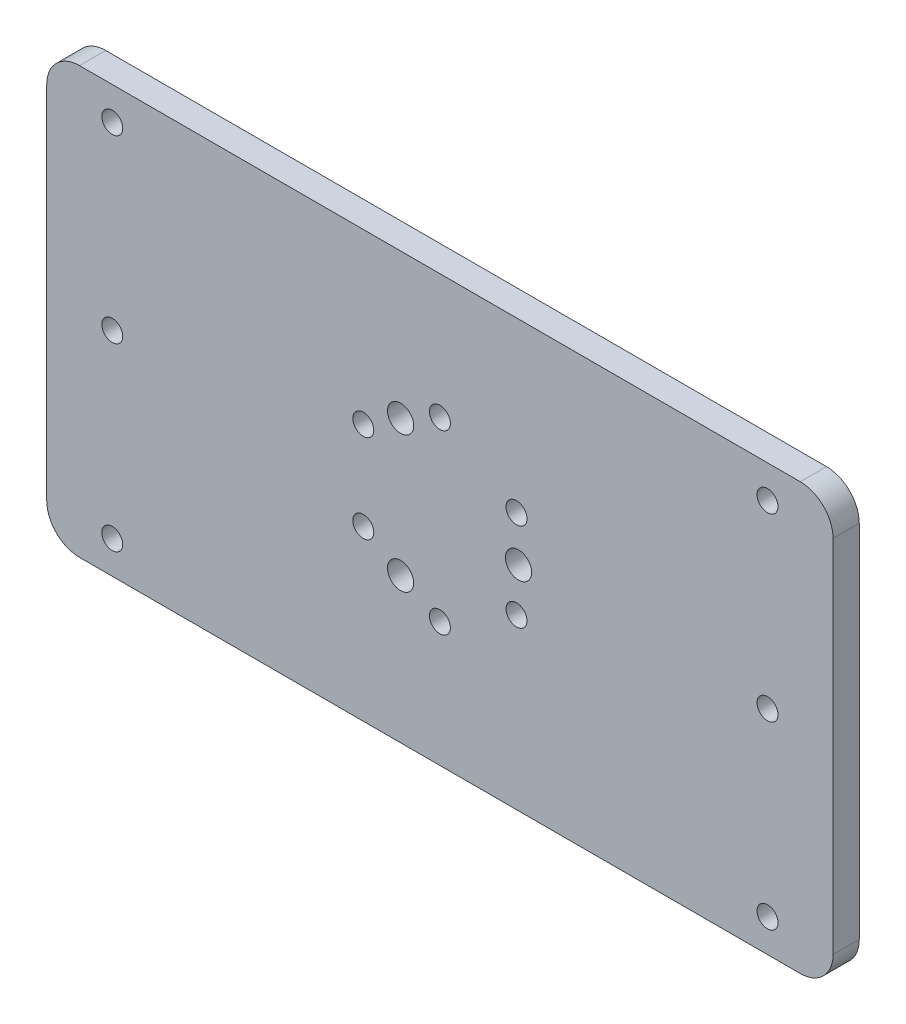
ISO-10303-21;
HEADER;
FILE_DESCRIPTION(('STEP AP214'),'2;1');
FILE_NAME('part.step','',(''),(''),'','','');
FILE_SCHEMA(('AUTOMOTIVE_DESIGN { 1 0 10303 214 1 1 1 1 }'));
ENDSEC;
DATA;
#1=APPLICATION_CONTEXT('core data for automotive mechanical design processes');
#2=APPLICATION_PROTOCOL_DEFINITION('international standard','automotive_design',2000,#1);
#3=PRODUCT_CONTEXT('',#1,'mechanical');
#4=PRODUCT('Part','Part','',(#3));
#5=PRODUCT_RELATED_PRODUCT_CATEGORY('part','',(#4));
#6=PRODUCT_DEFINITION_FORMATION('','',#4);
#7=PRODUCT_DEFINITION_CONTEXT('part definition',#1,'design');
#8=PRODUCT_DEFINITION('design','',#6,#7);
#9=PRODUCT_DEFINITION_SHAPE('','',#8);
#10=(LENGTH_UNIT() NAMED_UNIT(*) SI_UNIT(.MILLI.,.METRE.));
#11=(NAMED_UNIT(*) PLANE_ANGLE_UNIT() SI_UNIT($,.RADIAN.));
#12=(NAMED_UNIT(*) SI_UNIT($,.STERADIAN.) SOLID_ANGLE_UNIT());
#13=UNCERTAINTY_MEASURE_WITH_UNIT(LENGTH_MEASURE(1.E-05),#10,'distance_accuracy_value','');
#14=(GEOMETRIC_REPRESENTATION_CONTEXT(3) GLOBAL_UNCERTAINTY_ASSIGNED_CONTEXT((#13)) GLOBAL_UNIT_ASSIGNED_CONTEXT((#10,
#11,#12)) REPRESENTATION_CONTEXT('',''));
#15=CARTESIAN_POINT('',(0.,0.,0.));
#16=DIRECTION('',(0.,0.,1.));
#17=DIRECTION('',(1.,0.,0.));
#18=AXIS2_PLACEMENT_3D('',#15,#16,#17);
#19=CARTESIAN_POINT('',(0.,0.,4.));
#20=DIRECTION('',(1.,0.,0.));
#21=DIRECTION('',(0.,0.,-1.));
#22=AXIS2_PLACEMENT_3D('',#19,#20,#21);
#23=PLANE('',#22);
#24=DIRECTION('',(0.,-1.,0.));
#25=VECTOR('',#24,1.);
#26=CARTESIAN_POINT('',(0.,0.,0.));
#27=LINE('',#26,#25);
#28=CARTESIAN_POINT('',(0.,-5.,0.));
#29=VERTEX_POINT('',#28);
#30=CARTESIAN_POINT('',(0.,-60.,0.));
#31=VERTEX_POINT('',#30);
#32=EDGE_CURVE('E207',#29,#31,#27,.T.);
#33=ORIENTED_EDGE('',*,*,#32,.T.);
#34=DIRECTION('',(0.,0.,-1.));
#35=VECTOR('',#34,1.);
#36=CARTESIAN_POINT('',(0.,-60.,4.));
#37=LINE('',#36,#35);
#38=CARTESIAN_POINT('',(0.,-60.,4.));
#39=VERTEX_POINT('',#38);
#40=EDGE_CURVE('E11',#31,#39,#37,.F.);
#41=ORIENTED_EDGE('',*,*,#40,.T.);
#42=DIRECTION('',(0.,-1.,0.));
#43=VECTOR('',#42,1.);
#44=CARTESIAN_POINT('',(0.,0.,4.));
#45=LINE('',#44,#43);
#46=CARTESIAN_POINT('',(0.,-5.,4.));
#47=VERTEX_POINT('',#46);
#48=EDGE_CURVE('E135',#47,#39,#45,.T.);
#49=ORIENTED_EDGE('',*,*,#48,.F.);
#50=DIRECTION('',(0.,0.,-1.));
#51=VECTOR('',#50,1.);
#52=CARTESIAN_POINT('',(0.,-5.,4.));
#53=LINE('',#52,#51);
#54=EDGE_CURVE('E50',#47,#29,#53,.T.);
#55=ORIENTED_EDGE('',*,*,#54,.T.);
#56=EDGE_LOOP('',(#33,#41,#49,#55));
#57=FACE_BOUND('',#56,.T.);
#58=ADVANCED_FACE('F41',(#57),#23,.F.);
#59=CARTESIAN_POINT('',(0.,-65.,4.));
#60=DIRECTION('',(0.,1.,0.));
#61=DIRECTION('',(0.,0.,1.));
#62=AXIS2_PLACEMENT_3D('',#59,#60,#61);
#63=PLANE('',#62);
#64=DIRECTION('',(1.,0.,0.));
#65=VECTOR('',#64,1.);
#66=CARTESIAN_POINT('',(0.,-65.,0.));
#67=LINE('',#66,#65);
#68=CARTESIAN_POINT('',(5.,-65.,0.));
#69=VERTEX_POINT('',#68);
#70=CARTESIAN_POINT('',(115.,-65.,0.));
#71=VERTEX_POINT('',#70);
#72=EDGE_CURVE('E140',#69,#71,#67,.T.);
#73=ORIENTED_EDGE('',*,*,#72,.T.);
#74=DIRECTION('',(0.,0.,-1.));
#75=VECTOR('',#74,1.);
#76=CARTESIAN_POINT('',(115.,-65.,4.));
#77=LINE('',#76,#75);
#78=CARTESIAN_POINT('',(115.,-65.,4.));
#79=VERTEX_POINT('',#78);
#80=EDGE_CURVE('E58',#71,#79,#77,.F.);
#81=ORIENTED_EDGE('',*,*,#80,.T.);
#82=DIRECTION('',(1.,0.,0.));
#83=VECTOR('',#82,1.);
#84=CARTESIAN_POINT('',(0.,-65.,4.));
#85=LINE('',#84,#83);
#86=CARTESIAN_POINT('',(5.,-65.,4.));
#87=VERTEX_POINT('',#86);
#88=EDGE_CURVE('E138',#87,#79,#85,.T.);
#89=ORIENTED_EDGE('',*,*,#88,.F.);
#90=DIRECTION('',(0.,0.,-1.));
#91=VECTOR('',#90,1.);
#92=CARTESIAN_POINT('',(5.,-65.,4.));
#93=LINE('',#92,#91);
#94=EDGE_CURVE('E159',#87,#69,#93,.T.);
#95=ORIENTED_EDGE('',*,*,#94,.T.);
#96=EDGE_LOOP('',(#73,#81,#89,#95));
#97=FACE_BOUND('',#96,.T.);
#98=ADVANCED_FACE('F219',(#97),#63,.F.);
#99=CARTESIAN_POINT('',(120.,0.,4.));
#100=DIRECTION('',(-1.,0.,0.));
#101=DIRECTION('',(0.,-1.,0.));
#102=AXIS2_PLACEMENT_3D('',#99,#100,#101);
#103=PLANE('',#102);
#104=DIRECTION('',(0.,1.,0.));
#105=VECTOR('',#104,1.);
#106=CARTESIAN_POINT('',(120.,0.,0.));
#107=LINE('',#106,#105);
#108=CARTESIAN_POINT('',(120.,-60.,0.));
#109=VERTEX_POINT('',#108);
#110=CARTESIAN_POINT('',(120.,-5.,0.));
#111=VERTEX_POINT('',#110);
#112=EDGE_CURVE('E136',#109,#111,#107,.T.);
#113=ORIENTED_EDGE('',*,*,#112,.T.);
#114=DIRECTION('',(0.,0.,-1.));
#115=VECTOR('',#114,1.);
#116=CARTESIAN_POINT('',(120.,-5.,4.));
#117=LINE('',#116,#115);
#118=CARTESIAN_POINT('',(120.,-5.,4.));
#119=VERTEX_POINT('',#118);
#120=EDGE_CURVE('E114',#111,#119,#117,.F.);
#121=ORIENTED_EDGE('',*,*,#120,.T.);
#122=DIRECTION('',(0.,1.,0.));
#123=VECTOR('',#122,1.);
#124=CARTESIAN_POINT('',(120.,0.,4.));
#125=LINE('',#124,#123);
#126=CARTESIAN_POINT('',(120.,-60.,4.));
#127=VERTEX_POINT('',#126);
#128=EDGE_CURVE('E213',#127,#119,#125,.T.);
#129=ORIENTED_EDGE('',*,*,#128,.F.);
#130=DIRECTION('',(0.,0.,-1.));
#131=VECTOR('',#130,1.);
#132=CARTESIAN_POINT('',(120.,-60.,4.));
#133=LINE('',#132,#131);
#134=EDGE_CURVE('E119',#127,#109,#133,.T.);
#135=ORIENTED_EDGE('',*,*,#134,.T.);
#136=EDGE_LOOP('',(#113,#121,#129,#135));
#137=FACE_BOUND('',#136,.T.);
#138=ADVANCED_FACE('F228',(#137),#103,.F.);
#139=CARTESIAN_POINT('',(0.,0.,4.));
#140=DIRECTION('',(0.,-1.,0.));
#141=DIRECTION('',(0.,0.,-1.));
#142=AXIS2_PLACEMENT_3D('',#139,#140,#141);
#143=PLANE('',#142);
#144=DIRECTION('',(-1.,0.,0.));
#145=VECTOR('',#144,1.);
#146=CARTESIAN_POINT('',(0.,0.,4.));
#147=LINE('',#146,#145);
#148=CARTESIAN_POINT('',(115.,0.,4.));
#149=VERTEX_POINT('',#148);
#150=CARTESIAN_POINT('',(5.,0.,4.));
#151=VERTEX_POINT('',#150);
#152=EDGE_CURVE('E129',#149,#151,#147,.T.);
#153=ORIENTED_EDGE('',*,*,#152,.F.);
#154=DIRECTION('',(0.,0.,-1.));
#155=VECTOR('',#154,1.);
#156=CARTESIAN_POINT('',(115.,0.,4.));
#157=LINE('',#156,#155);
#158=CARTESIAN_POINT('',(115.,0.,0.));
#159=VERTEX_POINT('',#158);
#160=EDGE_CURVE('E113',#149,#159,#157,.T.);
#161=ORIENTED_EDGE('',*,*,#160,.T.);
#162=DIRECTION('',(-1.,0.,0.));
#163=VECTOR('',#162,1.);
#164=CARTESIAN_POINT('',(0.,0.,0.));
#165=LINE('',#164,#163);
#166=CARTESIAN_POINT('',(5.,0.,0.));
#167=VERTEX_POINT('',#166);
#168=EDGE_CURVE('E126',#159,#167,#165,.T.);
#169=ORIENTED_EDGE('',*,*,#168,.T.);
#170=DIRECTION('',(0.,0.,-1.));
#171=VECTOR('',#170,1.);
#172=CARTESIAN_POINT('',(5.,0.,4.));
#173=LINE('',#172,#171);
#174=EDGE_CURVE('E131',#167,#151,#173,.F.);
#175=ORIENTED_EDGE('',*,*,#174,.T.);
#176=EDGE_LOOP('',(#153,#161,#169,#175));
#177=FACE_BOUND('',#176,.T.);
#178=ADVANCED_FACE('F125',(#177),#143,.F.);
#179=CARTESIAN_POINT('',(0.,0.,4.));
#180=DIRECTION('',(0.,0.,1.));
#181=DIRECTION('',(1.,0.,0.));
#182=AXIS2_PLACEMENT_3D('',#179,#180,#181);
#183=PLANE('',#182);
#184=CARTESIAN_POINT('',(54.0000000000001,-22.1076951545866,4.));
#185=DIRECTION('',(0.,0.,1.));
#186=DIRECTION('',(1.,0.,0.));
#187=AXIS2_PLACEMENT_3D('',#184,#185,#186);
#188=CIRCLE('',#187,1.99999999999999);
#189=CARTESIAN_POINT('',(56.0000000000001,-22.1076951545866,4.));
#190=VERTEX_POINT('',#189);
#191=EDGE_CURVE('E369',#190,#190,#188,.T.);
#192=ORIENTED_EDGE('',*,*,#191,.F.);
#193=EDGE_LOOP('',(#192));
#194=FACE_BOUND('',#193,.T.);
#195=CARTESIAN_POINT('',(53.9999999999999,-42.8923048454133,4.));
#196=DIRECTION('',(0.,0.,1.));
#197=DIRECTION('',(1.,0.,0.));
#198=AXIS2_PLACEMENT_3D('',#195,#196,#197);
#199=CIRCLE('',#198,1.99999999999999);
#200=CARTESIAN_POINT('',(55.9999999999999,-42.8923048454133,4.));
#201=VERTEX_POINT('',#200);
#202=EDGE_CURVE('E372',#201,#201,#199,.T.);
#203=ORIENTED_EDGE('',*,*,#202,.F.);
#204=EDGE_LOOP('',(#203));
#205=FACE_BOUND('',#204,.T.);
#206=CARTESIAN_POINT('',(48.3086570489105,-25.7500000000005,4.));
#207=DIRECTION('',(0.,0.,1.));
#208=DIRECTION('',(1.,0.,0.));
#209=AXIS2_PLACEMENT_3D('',#206,#207,#208);
#210=CIRCLE('',#209,1.6);
#211=CARTESIAN_POINT('',(49.9086570489105,-25.7500000000005,4.));
#212=VERTEX_POINT('',#211);
#213=EDGE_CURVE('E375',#212,#212,#210,.T.);
#214=ORIENTED_EDGE('',*,*,#213,.F.);
#215=EDGE_LOOP('',(#214));
#216=FACE_BOUND('',#215,.T.);
#217=CARTESIAN_POINT('',(48.3086570489111,-39.2500000000005,4.));
#218=DIRECTION('',(0.,0.,1.));
#219=DIRECTION('',(1.,0.,0.));
#220=AXIS2_PLACEMENT_3D('',#217,#218,#219);
#221=CIRCLE('',#220,1.6);
#222=CARTESIAN_POINT('',(49.9086570489111,-39.2500000000005,4.));
#223=VERTEX_POINT('',#222);
#224=EDGE_CURVE('E378',#223,#223,#221,.T.);
#225=ORIENTED_EDGE('',*,*,#224,.F.);
#226=EDGE_LOOP('',(#225));
#227=FACE_BOUND('',#226,.T.);
#228=CARTESIAN_POINT('',(60.,-46.,4.));
#229=DIRECTION('',(0.,0.,1.));
#230=DIRECTION('',(1.,0.,0.));
#231=AXIS2_PLACEMENT_3D('',#228,#229,#230);
#232=CIRCLE('',#231,1.59999999999864);
#233=CARTESIAN_POINT('',(61.5999999999986,-46.,4.));
#234=VERTEX_POINT('',#233);
#235=EDGE_CURVE('E381',#234,#234,#232,.T.);
#236=ORIENTED_EDGE('',*,*,#235,.F.);
#237=EDGE_LOOP('',(#236));
#238=FACE_BOUND('',#237,.T.);
#239=CARTESIAN_POINT('',(71.6913429510899,-39.25,4.));
#240=DIRECTION('',(0.,0.,1.));
#241=DIRECTION('',(1.,0.,0.));
#242=AXIS2_PLACEMENT_3D('',#239,#240,#241);
#243=CIRCLE('',#242,1.59999999999916);
#244=CARTESIAN_POINT('',(73.2913429510891,-39.25,4.));
#245=VERTEX_POINT('',#244);
#246=EDGE_CURVE('E384',#245,#245,#243,.T.);
#247=ORIENTED_EDGE('',*,*,#246,.F.);
#248=EDGE_LOOP('',(#247));
#249=FACE_BOUND('',#248,.T.);
#250=CARTESIAN_POINT('',(71.6913429510903,-25.7499999999994,4.));
#251=DIRECTION('',(0.,0.,1.));
#252=DIRECTION('',(1.,0.,0.));
#253=AXIS2_PLACEMENT_3D('',#250,#251,#252);
#254=CIRCLE('',#253,1.6);
#255=CARTESIAN_POINT('',(73.2913429510903,-25.7499999999994,4.));
#256=VERTEX_POINT('',#255);
#257=EDGE_CURVE('E387',#256,#256,#254,.T.);
#258=ORIENTED_EDGE('',*,*,#257,.F.);
#259=EDGE_LOOP('',(#258));
#260=FACE_BOUND('',#259,.T.);
#261=CARTESIAN_POINT('',(60.,-19.,4.));
#262=DIRECTION('',(0.,0.,1.));
#263=DIRECTION('',(1.,0.,0.));
#264=AXIS2_PLACEMENT_3D('',#261,#262,#263);
#265=CIRCLE('',#264,1.6);
#266=CARTESIAN_POINT('',(61.6,-19.,4.));
#267=VERTEX_POINT('',#266);
#268=EDGE_CURVE('E368',#267,#267,#265,.T.);
#269=ORIENTED_EDGE('',*,*,#268,.F.);
#270=EDGE_LOOP('',(#269));
#271=FACE_BOUND('',#270,.T.);
#272=CARTESIAN_POINT('',(72.,-32.5,4.));
#273=DIRECTION('',(0.,0.,1.));
#274=DIRECTION('',(1.,0.,0.));
#275=AXIS2_PLACEMENT_3D('',#272,#273,#274);
#276=CIRCLE('',#275,2.);
#277=CARTESIAN_POINT('',(74.,-32.5,4.));
#278=VERTEX_POINT('',#277);
#279=EDGE_CURVE('E169',#278,#278,#276,.T.);
#280=ORIENTED_EDGE('',*,*,#279,.F.);
#281=EDGE_LOOP('',(#280));
#282=FACE_BOUND('',#281,.T.);
#283=CARTESIAN_POINT('',(110.,-5.00000000000001,4.));
#284=DIRECTION('',(0.,0.,1.));
#285=DIRECTION('',(-1.,0.,0.));
#286=AXIS2_PLACEMENT_3D('',#283,#284,#285);
#287=CIRCLE('',#286,1.59999999999999);
#288=CARTESIAN_POINT('',(108.4,-5.00000000000001,4.));
#289=VERTEX_POINT('',#288);
#290=EDGE_CURVE('E195',#289,#289,#287,.T.);
#291=ORIENTED_EDGE('',*,*,#290,.F.);
#292=EDGE_LOOP('',(#291));
#293=FACE_BOUND('',#292,.T.);
#294=CARTESIAN_POINT('',(110.,-32.5,4.));
#295=DIRECTION('',(0.,0.,1.));
#296=DIRECTION('',(-1.,0.,0.));
#297=AXIS2_PLACEMENT_3D('',#294,#295,#296);
#298=CIRCLE('',#297,1.59999999999999);
#299=CARTESIAN_POINT('',(108.4,-32.5,4.));
#300=VERTEX_POINT('',#299);
#301=EDGE_CURVE('E353',#300,#300,#298,.T.);
#302=ORIENTED_EDGE('',*,*,#301,.F.);
#303=EDGE_LOOP('',(#302));
#304=FACE_BOUND('',#303,.T.);
#305=CARTESIAN_POINT('',(110.,-60.,4.));
#306=DIRECTION('',(0.,0.,1.));
#307=DIRECTION('',(-1.,0.,0.));
#308=AXIS2_PLACEMENT_3D('',#305,#306,#307);
#309=CIRCLE('',#308,1.6);
#310=CARTESIAN_POINT('',(108.4,-60.,4.));
#311=VERTEX_POINT('',#310);
#312=EDGE_CURVE('E349',#311,#311,#309,.T.);
#313=ORIENTED_EDGE('',*,*,#312,.F.);
#314=EDGE_LOOP('',(#313));
#315=FACE_BOUND('',#314,.T.);
#316=CARTESIAN_POINT('',(10.,-60.,4.));
#317=DIRECTION('',(0.,0.,1.));
#318=DIRECTION('',(1.,0.,0.));
#319=AXIS2_PLACEMENT_3D('',#316,#317,#318);
#320=CIRCLE('',#319,1.6);
#321=CARTESIAN_POINT('',(11.6,-60.,4.));
#322=VERTEX_POINT('',#321);
#323=EDGE_CURVE('E340',#322,#322,#320,.T.);
#324=ORIENTED_EDGE('',*,*,#323,.F.);
#325=EDGE_LOOP('',(#324));
#326=FACE_BOUND('',#325,.T.);
#327=CARTESIAN_POINT('',(10.,-32.5,4.));
#328=DIRECTION('',(0.,0.,1.));
#329=DIRECTION('',(1.,0.,0.));
#330=AXIS2_PLACEMENT_3D('',#327,#328,#329);
#331=CIRCLE('',#330,1.6);
#332=CARTESIAN_POINT('',(11.6,-32.5,4.));
#333=VERTEX_POINT('',#332);
#334=EDGE_CURVE('E210',#333,#333,#331,.T.);
#335=ORIENTED_EDGE('',*,*,#334,.F.);
#336=EDGE_LOOP('',(#335));
#337=FACE_BOUND('',#336,.T.);
#338=CARTESIAN_POINT('',(10.,-5.,4.));
#339=DIRECTION('',(0.,0.,1.));
#340=DIRECTION('',(1.,0.,0.));
#341=AXIS2_PLACEMENT_3D('',#338,#339,#340);
#342=CIRCLE('',#341,1.6);
#343=CARTESIAN_POINT('',(11.6,-5.,4.));
#344=VERTEX_POINT('',#343);
#345=EDGE_CURVE('E208',#344,#344,#342,.T.);
#346=ORIENTED_EDGE('',*,*,#345,.F.);
#347=EDGE_LOOP('',(#346));
#348=FACE_BOUND('',#347,.T.);
#349=ORIENTED_EDGE('',*,*,#128,.T.);
#350=CARTESIAN_POINT('',(115.,-5.,4.));
#351=DIRECTION('',(0.,0.,1.));
#352=DIRECTION('',(1.,0.,0.));
#353=AXIS2_PLACEMENT_3D('',#350,#351,#352);
#354=CIRCLE('',#353,5.);
#355=EDGE_CURVE('E157',#119,#149,#354,.T.);
#356=ORIENTED_EDGE('',*,*,#355,.T.);
#357=ORIENTED_EDGE('',*,*,#152,.T.);
#358=CARTESIAN_POINT('',(5.,-5.,4.));
#359=DIRECTION('',(0.,0.,1.));
#360=DIRECTION('',(1.,0.,0.));
#361=AXIS2_PLACEMENT_3D('',#358,#359,#360);
#362=CIRCLE('',#361,5.);
#363=EDGE_CURVE('E152',#151,#47,#362,.T.);
#364=ORIENTED_EDGE('',*,*,#363,.T.);
#365=ORIENTED_EDGE('',*,*,#48,.T.);
#366=CARTESIAN_POINT('',(5.,-60.,4.));
#367=DIRECTION('',(0.,0.,1.));
#368=DIRECTION('',(1.,0.,0.));
#369=AXIS2_PLACEMENT_3D('',#366,#367,#368);
#370=CIRCLE('',#369,5.);
#371=EDGE_CURVE('E65',#39,#87,#370,.T.);
#372=ORIENTED_EDGE('',*,*,#371,.T.);
#373=ORIENTED_EDGE('',*,*,#88,.T.);
#374=CARTESIAN_POINT('',(115.,-60.,4.));
#375=DIRECTION('',(0.,0.,1.));
#376=DIRECTION('',(1.,0.,0.));
#377=AXIS2_PLACEMENT_3D('',#374,#375,#376);
#378=CIRCLE('',#377,5.);
#379=EDGE_CURVE('E155',#79,#127,#378,.T.);
#380=ORIENTED_EDGE('',*,*,#379,.T.);
#381=EDGE_LOOP('',(#349,#356,#357,#364,#365,#372,#373,#380));
#382=FACE_BOUND('',#381,.T.);
#383=ADVANCED_FACE('F226',(#194,#205,#216,#227,#238,#249,#260,#271,#282,#293,#304,#315,#326,
#337,#348,#382),#183,.T.);
#384=CARTESIAN_POINT('',(0.,0.,0.));
#385=DIRECTION('',(0.,0.,1.));
#386=DIRECTION('',(1.,0.,0.));
#387=AXIS2_PLACEMENT_3D('',#384,#385,#386);
#388=PLANE('',#387);
#389=CARTESIAN_POINT('',(54.0000000000001,-22.1076951545866,0.));
#390=DIRECTION('',(0.,0.,1.));
#391=DIRECTION('',(1.,0.,0.));
#392=AXIS2_PLACEMENT_3D('',#389,#390,#391);
#393=CIRCLE('',#392,1.99999999999999);
#394=CARTESIAN_POINT('',(56.0000000000001,-22.1076951545866,0.));
#395=VERTEX_POINT('',#394);
#396=EDGE_CURVE('E45',#395,#395,#393,.T.);
#397=ORIENTED_EDGE('',*,*,#396,.T.);
#398=EDGE_LOOP('',(#397));
#399=FACE_BOUND('',#398,.T.);
#400=CARTESIAN_POINT('',(53.9999999999999,-42.8923048454133,0.));
#401=DIRECTION('',(0.,0.,1.));
#402=DIRECTION('',(1.,0.,0.));
#403=AXIS2_PLACEMENT_3D('',#400,#401,#402);
#404=CIRCLE('',#403,1.99999999999999);
#405=CARTESIAN_POINT('',(55.9999999999999,-42.8923048454133,0.));
#406=VERTEX_POINT('',#405);
#407=EDGE_CURVE('E186',#406,#406,#404,.T.);
#408=ORIENTED_EDGE('',*,*,#407,.T.);
#409=EDGE_LOOP('',(#408));
#410=FACE_BOUND('',#409,.T.);
#411=CARTESIAN_POINT('',(48.3086570489105,-25.7500000000005,0.));
#412=DIRECTION('',(0.,0.,1.));
#413=DIRECTION('',(1.,0.,0.));
#414=AXIS2_PLACEMENT_3D('',#411,#412,#413);
#415=CIRCLE('',#414,1.6);
#416=CARTESIAN_POINT('',(49.9086570489105,-25.7500000000005,0.));
#417=VERTEX_POINT('',#416);
#418=EDGE_CURVE('E184',#417,#417,#415,.T.);
#419=ORIENTED_EDGE('',*,*,#418,.T.);
#420=EDGE_LOOP('',(#419));
#421=FACE_BOUND('',#420,.T.);
#422=CARTESIAN_POINT('',(48.3086570489111,-39.2500000000005,0.));
#423=DIRECTION('',(0.,0.,1.));
#424=DIRECTION('',(1.,0.,0.));
#425=AXIS2_PLACEMENT_3D('',#422,#423,#424);
#426=CIRCLE('',#425,1.6);
#427=CARTESIAN_POINT('',(49.9086570489111,-39.2500000000005,0.));
#428=VERTEX_POINT('',#427);
#429=EDGE_CURVE('E181',#428,#428,#426,.T.);
#430=ORIENTED_EDGE('',*,*,#429,.T.);
#431=EDGE_LOOP('',(#430));
#432=FACE_BOUND('',#431,.T.);
#433=CARTESIAN_POINT('',(60.,-46.,0.));
#434=DIRECTION('',(0.,0.,1.));
#435=DIRECTION('',(1.,0.,0.));
#436=AXIS2_PLACEMENT_3D('',#433,#434,#435);
#437=CIRCLE('',#436,1.59999999999864);
#438=CARTESIAN_POINT('',(61.5999999999986,-46.,0.));
#439=VERTEX_POINT('',#438);
#440=EDGE_CURVE('E178',#439,#439,#437,.T.);
#441=ORIENTED_EDGE('',*,*,#440,.T.);
#442=EDGE_LOOP('',(#441));
#443=FACE_BOUND('',#442,.T.);
#444=CARTESIAN_POINT('',(71.6913429510899,-39.25,0.));
#445=DIRECTION('',(0.,0.,1.));
#446=DIRECTION('',(1.,0.,0.));
#447=AXIS2_PLACEMENT_3D('',#444,#445,#446);
#448=CIRCLE('',#447,1.59999999999916);
#449=CARTESIAN_POINT('',(73.2913429510891,-39.25,0.));
#450=VERTEX_POINT('',#449);
#451=EDGE_CURVE('E175',#450,#450,#448,.T.);
#452=ORIENTED_EDGE('',*,*,#451,.T.);
#453=EDGE_LOOP('',(#452));
#454=FACE_BOUND('',#453,.T.);
#455=CARTESIAN_POINT('',(71.6913429510903,-25.7499999999994,0.));
#456=DIRECTION('',(0.,0.,1.));
#457=DIRECTION('',(1.,0.,0.));
#458=AXIS2_PLACEMENT_3D('',#455,#456,#457);
#459=CIRCLE('',#458,1.6);
#460=CARTESIAN_POINT('',(73.2913429510903,-25.7499999999994,0.));
#461=VERTEX_POINT('',#460);
#462=EDGE_CURVE('E172',#461,#461,#459,.T.);
#463=ORIENTED_EDGE('',*,*,#462,.T.);
#464=EDGE_LOOP('',(#463));
#465=FACE_BOUND('',#464,.T.);
#466=CARTESIAN_POINT('',(60.,-19.,0.));
#467=DIRECTION('',(0.,0.,1.));
#468=DIRECTION('',(1.,0.,0.));
#469=AXIS2_PLACEMENT_3D('',#466,#467,#468);
#470=CIRCLE('',#469,1.6);
#471=CARTESIAN_POINT('',(61.6,-19.,0.));
#472=VERTEX_POINT('',#471);
#473=EDGE_CURVE('E168',#472,#472,#470,.T.);
#474=ORIENTED_EDGE('',*,*,#473,.T.);
#475=EDGE_LOOP('',(#474));
#476=FACE_BOUND('',#475,.T.);
#477=CARTESIAN_POINT('',(72.,-32.5,0.));
#478=DIRECTION('',(0.,0.,1.));
#479=DIRECTION('',(1.,0.,0.));
#480=AXIS2_PLACEMENT_3D('',#477,#478,#479);
#481=CIRCLE('',#480,2.);
#482=CARTESIAN_POINT('',(74.,-32.5,0.));
#483=VERTEX_POINT('',#482);
#484=EDGE_CURVE('E165',#483,#483,#481,.T.);
#485=ORIENTED_EDGE('',*,*,#484,.T.);
#486=EDGE_LOOP('',(#485));
#487=FACE_BOUND('',#486,.T.);
#488=CARTESIAN_POINT('',(110.,-5.00000000000001,0.));
#489=DIRECTION('',(0.,0.,1.));
#490=DIRECTION('',(-1.,0.,0.));
#491=AXIS2_PLACEMENT_3D('',#488,#489,#490);
#492=CIRCLE('',#491,1.59999999999999);
#493=CARTESIAN_POINT('',(108.4,-5.00000000000001,0.));
#494=VERTEX_POINT('',#493);
#495=EDGE_CURVE('E191',#494,#494,#492,.T.);
#496=ORIENTED_EDGE('',*,*,#495,.T.);
#497=EDGE_LOOP('',(#496));
#498=FACE_BOUND('',#497,.T.);
#499=CARTESIAN_POINT('',(110.,-32.5,0.));
#500=DIRECTION('',(0.,0.,1.));
#501=DIRECTION('',(-1.,0.,0.));
#502=AXIS2_PLACEMENT_3D('',#499,#500,#501);
#503=CIRCLE('',#502,1.59999999999999);
#504=CARTESIAN_POINT('',(108.4,-32.5,0.));
#505=VERTEX_POINT('',#504);
#506=EDGE_CURVE('E200',#505,#505,#503,.T.);
#507=ORIENTED_EDGE('',*,*,#506,.T.);
#508=EDGE_LOOP('',(#507));
#509=FACE_BOUND('',#508,.T.);
#510=CARTESIAN_POINT('',(110.,-60.,0.));
#511=DIRECTION('',(0.,0.,1.));
#512=DIRECTION('',(-1.,0.,0.));
#513=AXIS2_PLACEMENT_3D('',#510,#511,#512);
#514=CIRCLE('',#513,1.6);
#515=CARTESIAN_POINT('',(108.4,-60.,0.));
#516=VERTEX_POINT('',#515);
#517=EDGE_CURVE('E327',#516,#516,#514,.T.);
#518=ORIENTED_EDGE('',*,*,#517,.T.);
#519=EDGE_LOOP('',(#518));
#520=FACE_BOUND('',#519,.T.);
#521=CARTESIAN_POINT('',(10.,-60.,0.));
#522=DIRECTION('',(0.,0.,1.));
#523=DIRECTION('',(1.,0.,0.));
#524=AXIS2_PLACEMENT_3D('',#521,#522,#523);
#525=CIRCLE('',#524,1.6);
#526=CARTESIAN_POINT('',(11.6,-60.,0.));
#527=VERTEX_POINT('',#526);
#528=EDGE_CURVE('E331',#527,#527,#525,.T.);
#529=ORIENTED_EDGE('',*,*,#528,.T.);
#530=EDGE_LOOP('',(#529));
#531=FACE_BOUND('',#530,.T.);
#532=CARTESIAN_POINT('',(10.,-32.5,0.));
#533=DIRECTION('',(0.,0.,1.));
#534=DIRECTION('',(1.,0.,0.));
#535=AXIS2_PLACEMENT_3D('',#532,#533,#534);
#536=CIRCLE('',#535,1.6);
#537=CARTESIAN_POINT('',(11.6,-32.5,0.));
#538=VERTEX_POINT('',#537);
#539=EDGE_CURVE('E335',#538,#538,#536,.T.);
#540=ORIENTED_EDGE('',*,*,#539,.T.);
#541=EDGE_LOOP('',(#540));
#542=FACE_BOUND('',#541,.T.);
#543=CARTESIAN_POINT('',(10.,-5.,0.));
#544=DIRECTION('',(0.,0.,1.));
#545=DIRECTION('',(1.,0.,0.));
#546=AXIS2_PLACEMENT_3D('',#543,#544,#545);
#547=CIRCLE('',#546,1.6);
#548=CARTESIAN_POINT('',(11.6,-5.,0.));
#549=VERTEX_POINT('',#548);
#550=EDGE_CURVE('E204',#549,#549,#547,.T.);
#551=ORIENTED_EDGE('',*,*,#550,.T.);
#552=EDGE_LOOP('',(#551));
#553=FACE_BOUND('',#552,.T.);
#554=ORIENTED_EDGE('',*,*,#168,.F.);
#555=CARTESIAN_POINT('',(115.,-5.,0.));
#556=DIRECTION('',(0.,0.,1.));
#557=DIRECTION('',(1.,0.,0.));
#558=AXIS2_PLACEMENT_3D('',#555,#556,#557);
#559=CIRCLE('',#558,5.);
#560=EDGE_CURVE('E109',#159,#111,#559,.F.);
#561=ORIENTED_EDGE('',*,*,#560,.T.);
#562=ORIENTED_EDGE('',*,*,#112,.F.);
#563=CARTESIAN_POINT('',(115.,-60.,0.));
#564=DIRECTION('',(0.,0.,1.));
#565=DIRECTION('',(1.,0.,0.));
#566=AXIS2_PLACEMENT_3D('',#563,#564,#565);
#567=CIRCLE('',#566,5.);
#568=EDGE_CURVE('E120',#109,#71,#567,.F.);
#569=ORIENTED_EDGE('',*,*,#568,.T.);
#570=ORIENTED_EDGE('',*,*,#72,.F.);
#571=CARTESIAN_POINT('',(5.,-60.,0.));
#572=DIRECTION('',(0.,0.,1.));
#573=DIRECTION('',(1.,0.,0.));
#574=AXIS2_PLACEMENT_3D('',#571,#572,#573);
#575=CIRCLE('',#574,5.);
#576=EDGE_CURVE('E146',#69,#31,#575,.F.);
#577=ORIENTED_EDGE('',*,*,#576,.T.);
#578=ORIENTED_EDGE('',*,*,#32,.F.);
#579=CARTESIAN_POINT('',(5.,-5.,0.));
#580=DIRECTION('',(0.,0.,1.));
#581=DIRECTION('',(1.,0.,0.));
#582=AXIS2_PLACEMENT_3D('',#579,#580,#581);
#583=CIRCLE('',#582,5.);
#584=EDGE_CURVE('E130',#29,#167,#583,.F.);
#585=ORIENTED_EDGE('',*,*,#584,.T.);
#586=EDGE_LOOP('',(#554,#561,#562,#569,#570,#577,#578,#585));
#587=FACE_BOUND('',#586,.T.);
#588=ADVANCED_FACE('F133',(#399,#410,#421,#432,#443,#454,#465,#476,#487,#498,#509,#520,#531,
#542,#553,#587),#388,.F.);
#589=CARTESIAN_POINT('',(10.,-5.,0.));
#590=DIRECTION('',(0.,0.,1.));
#591=DIRECTION('',(1.,0.,0.));
#592=AXIS2_PLACEMENT_3D('',#589,#590,#591);
#593=CYLINDRICAL_SURFACE('',#592,1.6);
#594=ORIENTED_EDGE('',*,*,#550,.F.);
#595=EDGE_LOOP('',(#594));
#596=FACE_BOUND('',#595,.T.);
#597=ORIENTED_EDGE('',*,*,#345,.T.);
#598=EDGE_LOOP('',(#597));
#599=FACE_BOUND('',#598,.T.);
#600=ADVANCED_FACE('F284',(#596,#599),#593,.F.);
#601=CARTESIAN_POINT('',(10.,-32.5,0.));
#602=DIRECTION('',(0.,0.,1.));
#603=DIRECTION('',(1.,0.,0.));
#604=AXIS2_PLACEMENT_3D('',#601,#602,#603);
#605=CYLINDRICAL_SURFACE('',#604,1.6);
#606=ORIENTED_EDGE('',*,*,#539,.F.);
#607=EDGE_LOOP('',(#606));
#608=FACE_BOUND('',#607,.T.);
#609=ORIENTED_EDGE('',*,*,#334,.T.);
#610=EDGE_LOOP('',(#609));
#611=FACE_BOUND('',#610,.T.);
#612=ADVANCED_FACE('F280',(#608,#611),#605,.F.);
#613=CARTESIAN_POINT('',(10.,-60.,0.));
#614=DIRECTION('',(0.,0.,1.));
#615=DIRECTION('',(1.,0.,0.));
#616=AXIS2_PLACEMENT_3D('',#613,#614,#615);
#617=CYLINDRICAL_SURFACE('',#616,1.6);
#618=ORIENTED_EDGE('',*,*,#528,.F.);
#619=EDGE_LOOP('',(#618));
#620=FACE_BOUND('',#619,.T.);
#621=ORIENTED_EDGE('',*,*,#323,.T.);
#622=EDGE_LOOP('',(#621));
#623=FACE_BOUND('',#622,.T.);
#624=ADVANCED_FACE('F283',(#620,#623),#617,.F.);
#625=CARTESIAN_POINT('',(110.,-60.,0.));
#626=DIRECTION('',(0.,0.,1.));
#627=DIRECTION('',(1.,0.,0.));
#628=AXIS2_PLACEMENT_3D('',#625,#626,#627);
#629=CYLINDRICAL_SURFACE('',#628,1.6);
#630=ORIENTED_EDGE('',*,*,#517,.F.);
#631=EDGE_LOOP('',(#630));
#632=FACE_BOUND('',#631,.T.);
#633=ORIENTED_EDGE('',*,*,#312,.T.);
#634=EDGE_LOOP('',(#633));
#635=FACE_BOUND('',#634,.T.);
#636=ADVANCED_FACE('F288',(#632,#635),#629,.F.);
#637=CARTESIAN_POINT('',(110.,-32.5,0.));
#638=DIRECTION('',(0.,0.,1.));
#639=DIRECTION('',(1.,0.,0.));
#640=AXIS2_PLACEMENT_3D('',#637,#638,#639);
#641=CYLINDRICAL_SURFACE('',#640,1.59999999999999);
#642=ORIENTED_EDGE('',*,*,#506,.F.);
#643=EDGE_LOOP('',(#642));
#644=FACE_BOUND('',#643,.T.);
#645=ORIENTED_EDGE('',*,*,#301,.T.);
#646=EDGE_LOOP('',(#645));
#647=FACE_BOUND('',#646,.T.);
#648=ADVANCED_FACE('F292',(#644,#647),#641,.F.);
#649=CARTESIAN_POINT('',(110.,-5.00000000000001,0.));
#650=DIRECTION('',(0.,0.,1.));
#651=DIRECTION('',(1.,0.,0.));
#652=AXIS2_PLACEMENT_3D('',#649,#650,#651);
#653=CYLINDRICAL_SURFACE('',#652,1.59999999999999);
#654=ORIENTED_EDGE('',*,*,#495,.F.);
#655=EDGE_LOOP('',(#654));
#656=FACE_BOUND('',#655,.T.);
#657=ORIENTED_EDGE('',*,*,#290,.T.);
#658=EDGE_LOOP('',(#657));
#659=FACE_BOUND('',#658,.T.);
#660=ADVANCED_FACE('F246',(#656,#659),#653,.F.);
#661=CARTESIAN_POINT('',(115.,-5.,4.));
#662=DIRECTION('',(0.,0.,-1.));
#663=DIRECTION('',(-1.,0.,0.));
#664=AXIS2_PLACEMENT_3D('',#661,#662,#663);
#665=CYLINDRICAL_SURFACE('',#664,5.);
#666=ORIENTED_EDGE('',*,*,#355,.F.);
#667=ORIENTED_EDGE('',*,*,#120,.F.);
#668=ORIENTED_EDGE('',*,*,#560,.F.);
#669=ORIENTED_EDGE('',*,*,#160,.F.);
#670=EDGE_LOOP('',(#666,#667,#668,#669));
#671=FACE_BOUND('',#670,.T.);
#672=ADVANCED_FACE('F112',(#671),#665,.T.);
#673=CARTESIAN_POINT('',(115.,-60.,4.));
#674=DIRECTION('',(0.,0.,-1.));
#675=DIRECTION('',(-1.,0.,0.));
#676=AXIS2_PLACEMENT_3D('',#673,#674,#675);
#677=CYLINDRICAL_SURFACE('',#676,5.);
#678=ORIENTED_EDGE('',*,*,#379,.F.);
#679=ORIENTED_EDGE('',*,*,#80,.F.);
#680=ORIENTED_EDGE('',*,*,#568,.F.);
#681=ORIENTED_EDGE('',*,*,#134,.F.);
#682=EDGE_LOOP('',(#678,#679,#680,#681));
#683=FACE_BOUND('',#682,.T.);
#684=ADVANCED_FACE('F223',(#683),#677,.T.);
#685=CARTESIAN_POINT('',(5.,-60.,4.));
#686=DIRECTION('',(0.,0.,-1.));
#687=DIRECTION('',(-1.,0.,0.));
#688=AXIS2_PLACEMENT_3D('',#685,#686,#687);
#689=CYLINDRICAL_SURFACE('',#688,5.);
#690=ORIENTED_EDGE('',*,*,#371,.F.);
#691=ORIENTED_EDGE('',*,*,#40,.F.);
#692=ORIENTED_EDGE('',*,*,#576,.F.);
#693=ORIENTED_EDGE('',*,*,#94,.F.);
#694=EDGE_LOOP('',(#690,#691,#692,#693));
#695=FACE_BOUND('',#694,.T.);
#696=ADVANCED_FACE('F248',(#695),#689,.T.);
#697=CARTESIAN_POINT('',(5.,-5.,4.));
#698=DIRECTION('',(0.,0.,-1.));
#699=DIRECTION('',(-1.,0.,0.));
#700=AXIS2_PLACEMENT_3D('',#697,#698,#699);
#701=CYLINDRICAL_SURFACE('',#700,5.);
#702=ORIENTED_EDGE('',*,*,#363,.F.);
#703=ORIENTED_EDGE('',*,*,#174,.F.);
#704=ORIENTED_EDGE('',*,*,#584,.F.);
#705=ORIENTED_EDGE('',*,*,#54,.F.);
#706=EDGE_LOOP('',(#702,#703,#704,#705));
#707=FACE_BOUND('',#706,.T.);
#708=ADVANCED_FACE('F43',(#707),#701,.T.);
#709=CARTESIAN_POINT('',(72.,-32.5,-8.5));
#710=DIRECTION('',(0.,0.,1.));
#711=DIRECTION('',(1.,0.,0.));
#712=AXIS2_PLACEMENT_3D('',#709,#710,#711);
#713=CYLINDRICAL_SURFACE('',#712,2.);
#714=ORIENTED_EDGE('',*,*,#279,.T.);
#715=EDGE_LOOP('',(#714));
#716=FACE_BOUND('',#715,.T.);
#717=ORIENTED_EDGE('',*,*,#484,.F.);
#718=EDGE_LOOP('',(#717));
#719=FACE_BOUND('',#718,.T.);
#720=ADVANCED_FACE('F254',(#716,#719),#713,.F.);
#721=CARTESIAN_POINT('',(60.,-19.,-8.5));
#722=DIRECTION('',(0.,0.,1.));
#723=DIRECTION('',(1.,0.,0.));
#724=AXIS2_PLACEMENT_3D('',#721,#722,#723);
#725=CYLINDRICAL_SURFACE('',#724,1.6);
#726=ORIENTED_EDGE('',*,*,#268,.T.);
#727=EDGE_LOOP('',(#726));
#728=FACE_BOUND('',#727,.T.);
#729=ORIENTED_EDGE('',*,*,#473,.F.);
#730=EDGE_LOOP('',(#729));
#731=FACE_BOUND('',#730,.T.);
#732=ADVANCED_FACE('F264',(#728,#731),#725,.F.);
#733=CARTESIAN_POINT('',(71.6913429510903,-25.7499999999994,-8.5));
#734=DIRECTION('',(0.,0.,1.));
#735=DIRECTION('',(1.,0.,0.));
#736=AXIS2_PLACEMENT_3D('',#733,#734,#735);
#737=CYLINDRICAL_SURFACE('',#736,1.6);
#738=ORIENTED_EDGE('',*,*,#257,.T.);
#739=EDGE_LOOP('',(#738));
#740=FACE_BOUND('',#739,.T.);
#741=ORIENTED_EDGE('',*,*,#462,.F.);
#742=EDGE_LOOP('',(#741));
#743=FACE_BOUND('',#742,.T.);
#744=ADVANCED_FACE('F271',(#740,#743),#737,.F.);
#745=CARTESIAN_POINT('',(71.6913429510899,-39.25,-8.5));
#746=DIRECTION('',(0.,0.,1.));
#747=DIRECTION('',(1.,0.,0.));
#748=AXIS2_PLACEMENT_3D('',#745,#746,#747);
#749=CYLINDRICAL_SURFACE('',#748,1.59999999999916);
#750=ORIENTED_EDGE('',*,*,#246,.T.);
#751=EDGE_LOOP('',(#750));
#752=FACE_BOUND('',#751,.T.);
#753=ORIENTED_EDGE('',*,*,#451,.F.);
#754=EDGE_LOOP('',(#753));
#755=FACE_BOUND('',#754,.T.);
#756=ADVANCED_FACE('F404',(#752,#755),#749,.F.);
#757=CARTESIAN_POINT('',(60.,-46.,-8.5));
#758=DIRECTION('',(0.,0.,1.));
#759=DIRECTION('',(1.,0.,0.));
#760=AXIS2_PLACEMENT_3D('',#757,#758,#759);
#761=CYLINDRICAL_SURFACE('',#760,1.59999999999864);
#762=ORIENTED_EDGE('',*,*,#235,.T.);
#763=EDGE_LOOP('',(#762));
#764=FACE_BOUND('',#763,.T.);
#765=ORIENTED_EDGE('',*,*,#440,.F.);
#766=EDGE_LOOP('',(#765));
#767=FACE_BOUND('',#766,.T.);
#768=ADVANCED_FACE('F409',(#764,#767),#761,.F.);
#769=CARTESIAN_POINT('',(48.3086570489111,-39.2500000000005,-8.5));
#770=DIRECTION('',(0.,0.,1.));
#771=DIRECTION('',(1.,0.,0.));
#772=AXIS2_PLACEMENT_3D('',#769,#770,#771);
#773=CYLINDRICAL_SURFACE('',#772,1.6);
#774=ORIENTED_EDGE('',*,*,#224,.T.);
#775=EDGE_LOOP('',(#774));
#776=FACE_BOUND('',#775,.T.);
#777=ORIENTED_EDGE('',*,*,#429,.F.);
#778=EDGE_LOOP('',(#777));
#779=FACE_BOUND('',#778,.T.);
#780=ADVANCED_FACE('F415',(#776,#779),#773,.F.);
#781=CARTESIAN_POINT('',(48.3086570489105,-25.7500000000005,-8.5));
#782=DIRECTION('',(0.,0.,1.));
#783=DIRECTION('',(1.,0.,0.));
#784=AXIS2_PLACEMENT_3D('',#781,#782,#783);
#785=CYLINDRICAL_SURFACE('',#784,1.6);
#786=ORIENTED_EDGE('',*,*,#213,.T.);
#787=EDGE_LOOP('',(#786));
#788=FACE_BOUND('',#787,.T.);
#789=ORIENTED_EDGE('',*,*,#418,.F.);
#790=EDGE_LOOP('',(#789));
#791=FACE_BOUND('',#790,.T.);
#792=ADVANCED_FACE('F419',(#788,#791),#785,.F.);
#793=CARTESIAN_POINT('',(53.9999999999999,-42.8923048454133,-8.5));
#794=DIRECTION('',(0.,0.,1.));
#795=DIRECTION('',(1.,0.,0.));
#796=AXIS2_PLACEMENT_3D('',#793,#794,#795);
#797=CYLINDRICAL_SURFACE('',#796,1.99999999999999);
#798=ORIENTED_EDGE('',*,*,#202,.T.);
#799=EDGE_LOOP('',(#798));
#800=FACE_BOUND('',#799,.T.);
#801=ORIENTED_EDGE('',*,*,#407,.F.);
#802=EDGE_LOOP('',(#801));
#803=FACE_BOUND('',#802,.T.);
#804=ADVANCED_FACE('F422',(#800,#803),#797,.F.);
#805=CARTESIAN_POINT('',(54.0000000000001,-22.1076951545866,-8.5));
#806=DIRECTION('',(0.,0.,1.));
#807=DIRECTION('',(1.,0.,0.));
#808=AXIS2_PLACEMENT_3D('',#805,#806,#807);
#809=CYLINDRICAL_SURFACE('',#808,1.99999999999999);
#810=ORIENTED_EDGE('',*,*,#191,.T.);
#811=EDGE_LOOP('',(#810));
#812=FACE_BOUND('',#811,.T.);
#813=ORIENTED_EDGE('',*,*,#396,.F.);
#814=EDGE_LOOP('',(#813));
#815=FACE_BOUND('',#814,.T.);
#816=ADVANCED_FACE('F278',(#812,#815),#809,.F.);
#817=CLOSED_SHELL('',(#58,#98,#138,#178,#383,#588,#600,#612,#624,#636,#648,#660,#672,#684,#696,
#708,#720,#732,#744,#756,#768,#780,#792,#804,#816));
#818=MANIFOLD_SOLID_BREP('B2',#817);
#819=ADVANCED_BREP_SHAPE_REPRESENTATION('',(#18,#818),#14);
#820=SHAPE_DEFINITION_REPRESENTATION(#9,#819);
ENDSEC;
END-ISO-10303-21;
